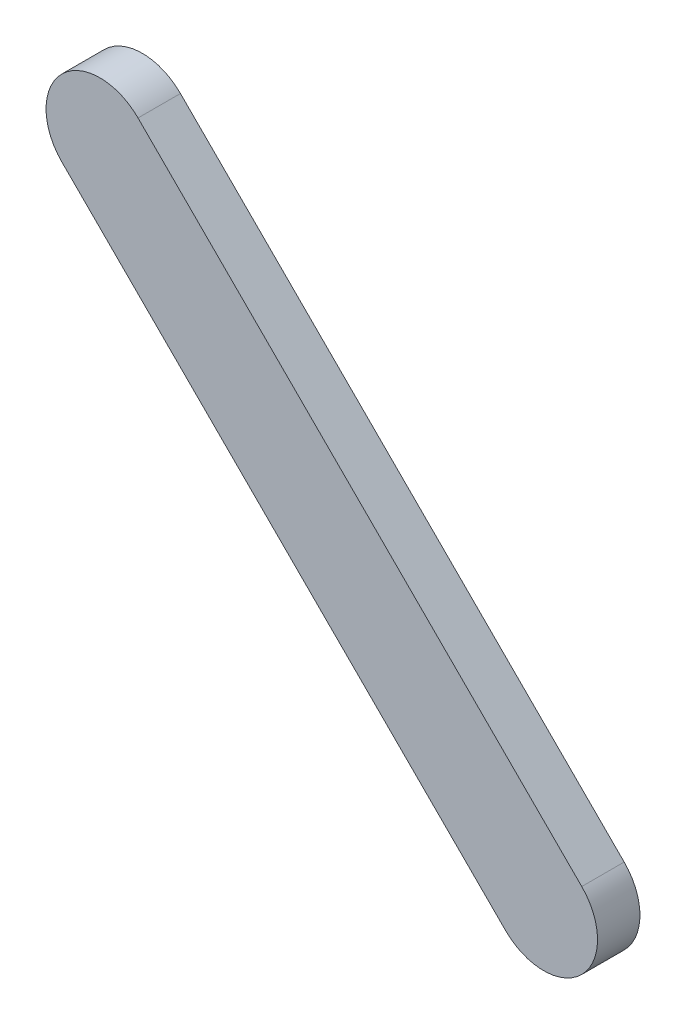
ISO-10303-21;
HEADER;
FILE_DESCRIPTION(('STEP AP214'),'2;1');
FILE_NAME('part.step','',(''),(''),'','','');
FILE_SCHEMA(('AUTOMOTIVE_DESIGN { 1 0 10303 214 1 1 1 1 }'));
ENDSEC;
DATA;
#1=APPLICATION_CONTEXT('core data for automotive mechanical design processes');
#2=APPLICATION_PROTOCOL_DEFINITION('international standard','automotive_design',2000,#1);
#3=PRODUCT_CONTEXT('',#1,'mechanical');
#4=PRODUCT('Part','Part','',(#3));
#5=PRODUCT_RELATED_PRODUCT_CATEGORY('part','',(#4));
#6=PRODUCT_DEFINITION_FORMATION('','',#4);
#7=PRODUCT_DEFINITION_CONTEXT('part definition',#1,'design');
#8=PRODUCT_DEFINITION('design','',#6,#7);
#9=PRODUCT_DEFINITION_SHAPE('','',#8);
#10=(LENGTH_UNIT() NAMED_UNIT(*) SI_UNIT(.MILLI.,.METRE.));
#11=(NAMED_UNIT(*) PLANE_ANGLE_UNIT() SI_UNIT($,.RADIAN.));
#12=(NAMED_UNIT(*) SI_UNIT($,.STERADIAN.) SOLID_ANGLE_UNIT());
#13=UNCERTAINTY_MEASURE_WITH_UNIT(LENGTH_MEASURE(1.E-05),#10,'distance_accuracy_value','');
#14=(GEOMETRIC_REPRESENTATION_CONTEXT(3) GLOBAL_UNCERTAINTY_ASSIGNED_CONTEXT((#13)) GLOBAL_UNIT_ASSIGNED_CONTEXT((#10,
#11,#12)) REPRESENTATION_CONTEXT('',''));
#15=CARTESIAN_POINT('',(0.,0.,0.));
#16=DIRECTION('',(0.,0.,1.));
#17=DIRECTION('',(1.,0.,0.));
#18=AXIS2_PLACEMENT_3D('',#15,#16,#17);
#19=CARTESIAN_POINT('',(116.8539954,118.37179526,0.));
#20=DIRECTION('',(0.707106781186548,0.707106781186548,0.));
#21=DIRECTION('',(0.707106781186548,-0.707106781186548,0.));
#22=AXIS2_PLACEMENT_3D('',#19,#20,#21);
#23=PLANE('',#22);
#24=DIRECTION('',(0.707106781186548,-0.707106781186548,0.));
#25=VECTOR('',#24,1.);
#26=CARTESIAN_POINT('',(116.8539954,118.37179526,0.1999996));
#27=LINE('',#26,#25);
#28=CARTESIAN_POINT('',(116.8539954,118.37179526,0.1999996));
#29=VERTEX_POINT('',#28);
#30=CARTESIAN_POINT('',(118.94639406,116.2793966,0.1999996));
#31=VERTEX_POINT('',#30);
#32=EDGE_CURVE('E11',#29,#31,#27,.T.);
#33=ORIENTED_EDGE('',*,*,#32,.F.);
#34=DIRECTION('',(0.,0.,1.));
#35=VECTOR('',#34,1.);
#36=CARTESIAN_POINT('',(116.8539954,118.37179526,0.));
#37=LINE('',#36,#35);
#38=CARTESIAN_POINT('',(116.8539954,118.37179526,0.));
#39=VERTEX_POINT('',#38);
#40=EDGE_CURVE('E24',#39,#29,#37,.T.);
#41=ORIENTED_EDGE('',*,*,#40,.F.);
#42=DIRECTION('',(0.707106781186548,-0.707106781186548,0.));
#43=VECTOR('',#42,1.);
#44=CARTESIAN_POINT('',(116.8539954,118.37179526,0.));
#45=LINE('',#44,#43);
#46=CARTESIAN_POINT('',(118.94639406,116.2793966,0.));
#47=VERTEX_POINT('',#46);
#48=EDGE_CURVE('E75',#39,#47,#45,.T.);
#49=ORIENTED_EDGE('',*,*,#48,.T.);
#50=DIRECTION('',(0.,0.,1.));
#51=VECTOR('',#50,1.);
#52=CARTESIAN_POINT('',(118.94639406,116.2793966,0.));
#53=LINE('',#52,#51);
#54=EDGE_CURVE('E37',#47,#31,#53,.T.);
#55=ORIENTED_EDGE('',*,*,#54,.T.);
#56=EDGE_LOOP('',(#33,#41,#49,#55));
#57=FACE_BOUND('',#56,.T.);
#58=ADVANCED_FACE('F17',(#57),#23,.F.);
#59=CARTESIAN_POINT('',(119.12599873,116.45900127,0.));
#60=DIRECTION('',(0.,0.,-1.));
#61=DIRECTION('',(-0.707106781186576,-0.70710678118652,0.));
#62=AXIS2_PLACEMENT_3D('',#59,#60,#61);
#63=CYLINDRICAL_SURFACE('',#62,0.253999360179542);
#64=CARTESIAN_POINT('',(119.12599873,116.45900127,0.1999996));
#65=DIRECTION('',(0.,0.,1.));
#66=DIRECTION('',(-0.707106781186576,-0.70710678118652,0.));
#67=AXIS2_PLACEMENT_3D('',#64,#65,#66);
#68=CIRCLE('',#67,0.253999360179542);
#69=CARTESIAN_POINT('',(119.3056034,116.63860594,0.1999996));
#70=VERTEX_POINT('',#69);
#71=EDGE_CURVE('E83',#31,#70,#68,.T.);
#72=ORIENTED_EDGE('',*,*,#71,.F.);
#73=ORIENTED_EDGE('',*,*,#54,.F.);
#74=CARTESIAN_POINT('',(119.12599873,116.45900127,0.));
#75=DIRECTION('',(0.,0.,1.));
#76=DIRECTION('',(-0.707106781186576,-0.70710678118652,0.));
#77=AXIS2_PLACEMENT_3D('',#74,#75,#76);
#78=CIRCLE('',#77,0.253999360179542);
#79=CARTESIAN_POINT('',(119.3056034,116.63860594,0.));
#80=VERTEX_POINT('',#79);
#81=EDGE_CURVE('E81',#47,#80,#78,.T.);
#82=ORIENTED_EDGE('',*,*,#81,.T.);
#83=DIRECTION('',(0.,0.,1.));
#84=VECTOR('',#83,1.);
#85=CARTESIAN_POINT('',(119.3056034,116.63860594,0.));
#86=LINE('',#85,#84);
#87=EDGE_CURVE('E67',#80,#70,#86,.T.);
#88=ORIENTED_EDGE('',*,*,#87,.T.);
#89=EDGE_LOOP('',(#72,#73,#82,#88));
#90=FACE_BOUND('',#89,.T.);
#91=ADVANCED_FACE('F89',(#90),#63,.T.);
#92=CARTESIAN_POINT('',(119.3056034,116.63860594,0.));
#93=DIRECTION('',(-0.70710678118655,-0.707106781186545,0.));
#94=DIRECTION('',(-0.707106781186545,0.70710678118655,0.));
#95=AXIS2_PLACEMENT_3D('',#92,#93,#94);
#96=PLANE('',#95);
#97=DIRECTION('',(-0.707106781186545,0.70710678118655,0.));
#98=VECTOR('',#97,1.);
#99=CARTESIAN_POINT('',(119.3056034,116.63860594,0.1999996));
#100=LINE('',#99,#98);
#101=CARTESIAN_POINT('',(117.21320474,118.7310046,0.1999996));
#102=VERTEX_POINT('',#101);
#103=EDGE_CURVE('E71',#70,#102,#100,.T.);
#104=ORIENTED_EDGE('',*,*,#103,.F.);
#105=ORIENTED_EDGE('',*,*,#87,.F.);
#106=DIRECTION('',(-0.707106781186545,0.70710678118655,0.));
#107=VECTOR('',#106,1.);
#108=CARTESIAN_POINT('',(119.3056034,116.63860594,0.));
#109=LINE('',#108,#107);
#110=CARTESIAN_POINT('',(117.21320474,118.7310046,0.));
#111=VERTEX_POINT('',#110);
#112=EDGE_CURVE('E63',#80,#111,#109,.T.);
#113=ORIENTED_EDGE('',*,*,#112,.T.);
#114=DIRECTION('',(0.,0.,1.));
#115=VECTOR('',#114,1.);
#116=CARTESIAN_POINT('',(117.21320474,118.7310046,0.));
#117=LINE('',#116,#115);
#118=EDGE_CURVE('E53',#111,#102,#117,.T.);
#119=ORIENTED_EDGE('',*,*,#118,.T.);
#120=EDGE_LOOP('',(#104,#105,#113,#119));
#121=FACE_BOUND('',#120,.T.);
#122=ADVANCED_FACE('F66',(#121),#96,.F.);
#123=CARTESIAN_POINT('',(117.03360007,118.55139993,0.));
#124=DIRECTION('',(0.,0.,-1.));
#125=DIRECTION('',(0.707106781186576,0.70710678118652,0.));
#126=AXIS2_PLACEMENT_3D('',#123,#124,#125);
#127=CYLINDRICAL_SURFACE('',#126,0.253999360179549);
#128=CARTESIAN_POINT('',(117.03360007,118.55139993,0.1999996));
#129=DIRECTION('',(0.,0.,1.));
#130=DIRECTION('',(0.707106781186576,0.70710678118652,0.));
#131=AXIS2_PLACEMENT_3D('',#128,#129,#130);
#132=CIRCLE('',#131,0.253999360179549);
#133=EDGE_CURVE('E59',#102,#29,#132,.T.);
#134=ORIENTED_EDGE('',*,*,#133,.F.);
#135=ORIENTED_EDGE('',*,*,#118,.F.);
#136=CARTESIAN_POINT('',(117.03360007,118.55139993,0.));
#137=DIRECTION('',(0.,0.,1.));
#138=DIRECTION('',(0.707106781186576,0.70710678118652,0.));
#139=AXIS2_PLACEMENT_3D('',#136,#137,#138);
#140=CIRCLE('',#139,0.253999360179549);
#141=EDGE_CURVE('E57',#111,#39,#140,.T.);
#142=ORIENTED_EDGE('',*,*,#141,.T.);
#143=ORIENTED_EDGE('',*,*,#40,.T.);
#144=EDGE_LOOP('',(#134,#135,#142,#143));
#145=FACE_BOUND('',#144,.T.);
#146=ADVANCED_FACE('F55',(#145),#127,.T.);
#147=CARTESIAN_POINT('',(116.8539954,118.37179526,0.));
#148=DIRECTION('',(0.,0.,-1.));
#149=DIRECTION('',(-1.,0.,0.));
#150=AXIS2_PLACEMENT_3D('',#147,#148,#149);
#151=PLANE('',#150);
#152=ORIENTED_EDGE('',*,*,#141,.F.);
#153=ORIENTED_EDGE('',*,*,#112,.F.);
#154=ORIENTED_EDGE('',*,*,#81,.F.);
#155=ORIENTED_EDGE('',*,*,#48,.F.);
#156=EDGE_LOOP('',(#152,#153,#154,#155));
#157=FACE_BOUND('',#156,.T.);
#158=ADVANCED_FACE('F74',(#157),#151,.T.);
#159=CARTESIAN_POINT('',(116.8539954,118.37179526,0.1999996));
#160=DIRECTION('',(0.,0.,-1.));
#161=DIRECTION('',(-1.,0.,0.));
#162=AXIS2_PLACEMENT_3D('',#159,#160,#161);
#163=PLANE('',#162);
#164=ORIENTED_EDGE('',*,*,#32,.T.);
#165=ORIENTED_EDGE('',*,*,#71,.T.);
#166=ORIENTED_EDGE('',*,*,#103,.T.);
#167=ORIENTED_EDGE('',*,*,#133,.T.);
#168=EDGE_LOOP('',(#164,#165,#166,#167));
#169=FACE_BOUND('',#168,.T.);
#170=ADVANCED_FACE('F91',(#169),#163,.F.);
#171=CLOSED_SHELL('',(#58,#91,#122,#146,#158,#170));
#172=MANIFOLD_SOLID_BREP('B1',#171);
#173=ADVANCED_BREP_SHAPE_REPRESENTATION('',(#18,#172),#14);
#174=SHAPE_DEFINITION_REPRESENTATION(#9,#173);
ENDSEC;
END-ISO-10303-21;
